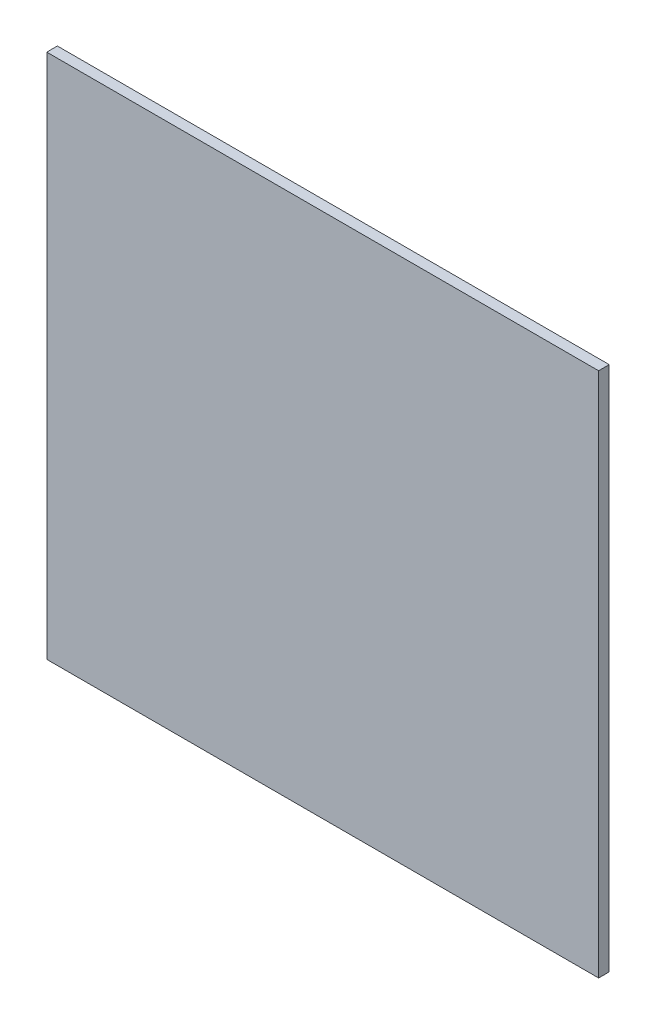
ISO-10303-21;
HEADER;
FILE_DESCRIPTION(('STEP AP214'),'2;1');
FILE_NAME('part.step','',(''),(''),'','','');
FILE_SCHEMA(('AUTOMOTIVE_DESIGN { 1 0 10303 214 1 1 1 1 }'));
ENDSEC;
DATA;
#1=APPLICATION_CONTEXT('core data for automotive mechanical design processes');
#2=APPLICATION_PROTOCOL_DEFINITION('international standard','automotive_design',2000,#1);
#3=PRODUCT_CONTEXT('',#1,'mechanical');
#4=PRODUCT('Part','Part','',(#3));
#5=PRODUCT_RELATED_PRODUCT_CATEGORY('part','',(#4));
#6=PRODUCT_DEFINITION_FORMATION('','',#4);
#7=PRODUCT_DEFINITION_CONTEXT('part definition',#1,'design');
#8=PRODUCT_DEFINITION('design','',#6,#7);
#9=PRODUCT_DEFINITION_SHAPE('','',#8);
#10=(LENGTH_UNIT() NAMED_UNIT(*) SI_UNIT(.MILLI.,.METRE.));
#11=(NAMED_UNIT(*) PLANE_ANGLE_UNIT() SI_UNIT($,.RADIAN.));
#12=(NAMED_UNIT(*) SI_UNIT($,.STERADIAN.) SOLID_ANGLE_UNIT());
#13=UNCERTAINTY_MEASURE_WITH_UNIT(LENGTH_MEASURE(1.E-05),#10,'distance_accuracy_value','');
#14=(GEOMETRIC_REPRESENTATION_CONTEXT(3) GLOBAL_UNCERTAINTY_ASSIGNED_CONTEXT((#13)) GLOBAL_UNIT_ASSIGNED_CONTEXT((#10,
#11,#12)) REPRESENTATION_CONTEXT('',''));
#15=CARTESIAN_POINT('',(0.,0.,0.));
#16=DIRECTION('',(0.,0.,1.));
#17=DIRECTION('',(1.,0.,0.));
#18=AXIS2_PLACEMENT_3D('',#15,#16,#17);
#19=CARTESIAN_POINT('',(78.,-79.6217987433848,3.));
#20=DIRECTION('',(-1.,0.,0.));
#21=DIRECTION('',(0.,0.,1.));
#22=AXIS2_PLACEMENT_3D('',#19,#20,#21);
#23=PLANE('',#22);
#24=DIRECTION('',(0.,1.,0.));
#25=VECTOR('',#24,1.);
#26=CARTESIAN_POINT('',(78.,-79.6217987433848,0.));
#27=LINE('',#26,#25);
#28=CARTESIAN_POINT('',(78.,-79.6217987433848,0.));
#29=VERTEX_POINT('',#28);
#30=CARTESIAN_POINT('',(78.,69.0382012566152,0.));
#31=VERTEX_POINT('',#30);
#32=EDGE_CURVE('E96',#29,#31,#27,.T.);
#33=ORIENTED_EDGE('',*,*,#32,.T.);
#34=DIRECTION('',(0.,0.,-1.));
#35=VECTOR('',#34,1.);
#36=CARTESIAN_POINT('',(78.,69.0382012566152,3.));
#37=LINE('',#36,#35);
#38=CARTESIAN_POINT('',(78.,69.0382012566152,3.));
#39=VERTEX_POINT('',#38);
#40=EDGE_CURVE('E11',#39,#31,#37,.T.);
#41=ORIENTED_EDGE('',*,*,#40,.F.);
#42=DIRECTION('',(0.,1.,0.));
#43=VECTOR('',#42,1.);
#44=CARTESIAN_POINT('',(78.,-79.6217987433848,3.));
#45=LINE('',#44,#43);
#46=CARTESIAN_POINT('',(78.,-79.6217987433848,3.));
#47=VERTEX_POINT('',#46);
#48=EDGE_CURVE('E84',#47,#39,#45,.T.);
#49=ORIENTED_EDGE('',*,*,#48,.F.);
#50=DIRECTION('',(0.,0.,-1.));
#51=VECTOR('',#50,1.);
#52=CARTESIAN_POINT('',(78.,-79.6217987433848,3.));
#53=LINE('',#52,#51);
#54=EDGE_CURVE('E92',#47,#29,#53,.T.);
#55=ORIENTED_EDGE('',*,*,#54,.T.);
#56=EDGE_LOOP('',(#33,#41,#49,#55));
#57=FACE_BOUND('',#56,.T.);
#58=ADVANCED_FACE('F33',(#57),#23,.F.);
#59=CARTESIAN_POINT('',(-78.,69.0382012566152,3.));
#60=DIRECTION('',(0.,-1.,0.));
#61=DIRECTION('',(0.,0.,-1.));
#62=AXIS2_PLACEMENT_3D('',#59,#60,#61);
#63=PLANE('',#62);
#64=DIRECTION('',(-1.,0.,0.));
#65=VECTOR('',#64,1.);
#66=CARTESIAN_POINT('',(-78.,69.0382012566152,0.));
#67=LINE('',#66,#65);
#68=CARTESIAN_POINT('',(-78.,69.0382012566152,0.));
#69=VERTEX_POINT('',#68);
#70=EDGE_CURVE('E88',#31,#69,#67,.T.);
#71=ORIENTED_EDGE('',*,*,#70,.T.);
#72=DIRECTION('',(0.,0.,-1.));
#73=VECTOR('',#72,1.);
#74=CARTESIAN_POINT('',(-78.,69.0382012566152,3.));
#75=LINE('',#74,#73);
#76=CARTESIAN_POINT('',(-78.,69.0382012566152,3.));
#77=VERTEX_POINT('',#76);
#78=EDGE_CURVE('E41',#77,#69,#75,.T.);
#79=ORIENTED_EDGE('',*,*,#78,.F.);
#80=DIRECTION('',(-1.,0.,0.));
#81=VECTOR('',#80,1.);
#82=CARTESIAN_POINT('',(-78.,69.0382012566152,3.));
#83=LINE('',#82,#81);
#84=EDGE_CURVE('E79',#39,#77,#83,.T.);
#85=ORIENTED_EDGE('',*,*,#84,.F.);
#86=ORIENTED_EDGE('',*,*,#40,.T.);
#87=EDGE_LOOP('',(#71,#79,#85,#86));
#88=FACE_BOUND('',#87,.T.);
#89=ADVANCED_FACE('F87',(#88),#63,.F.);
#90=CARTESIAN_POINT('',(-78.,-79.6217987433848,3.));
#91=DIRECTION('',(1.,0.,0.));
#92=DIRECTION('',(0.,0.,-1.));
#93=AXIS2_PLACEMENT_3D('',#90,#91,#92);
#94=PLANE('',#93);
#95=DIRECTION('',(0.,-1.,0.));
#96=VECTOR('',#95,1.);
#97=CARTESIAN_POINT('',(-78.,-79.6217987433848,0.));
#98=LINE('',#97,#96);
#99=CARTESIAN_POINT('',(-78.,-79.6217987433848,0.));
#100=VERTEX_POINT('',#99);
#101=EDGE_CURVE('E66',#69,#100,#98,.T.);
#102=ORIENTED_EDGE('',*,*,#101,.T.);
#103=DIRECTION('',(0.,0.,-1.));
#104=VECTOR('',#103,1.);
#105=CARTESIAN_POINT('',(-78.,-79.6217987433848,3.));
#106=LINE('',#105,#104);
#107=CARTESIAN_POINT('',(-78.,-79.6217987433848,3.));
#108=VERTEX_POINT('',#107);
#109=EDGE_CURVE('E89',#108,#100,#106,.T.);
#110=ORIENTED_EDGE('',*,*,#109,.F.);
#111=DIRECTION('',(0.,-1.,0.));
#112=VECTOR('',#111,1.);
#113=CARTESIAN_POINT('',(-78.,-79.6217987433848,3.));
#114=LINE('',#113,#112);
#115=EDGE_CURVE('E82',#77,#108,#114,.T.);
#116=ORIENTED_EDGE('',*,*,#115,.F.);
#117=ORIENTED_EDGE('',*,*,#78,.T.);
#118=EDGE_LOOP('',(#102,#110,#116,#117));
#119=FACE_BOUND('',#118,.T.);
#120=ADVANCED_FACE('F90',(#119),#94,.F.);
#121=CARTESIAN_POINT('',(-78.,-79.6217987433848,3.));
#122=DIRECTION('',(0.,1.,0.));
#123=DIRECTION('',(0.,0.,1.));
#124=AXIS2_PLACEMENT_3D('',#121,#122,#123);
#125=PLANE('',#124);
#126=DIRECTION('',(1.,0.,0.));
#127=VECTOR('',#126,1.);
#128=CARTESIAN_POINT('',(-78.,-79.6217987433848,0.));
#129=LINE('',#128,#127);
#130=EDGE_CURVE('E72',#100,#29,#129,.T.);
#131=ORIENTED_EDGE('',*,*,#130,.T.);
#132=ORIENTED_EDGE('',*,*,#54,.F.);
#133=DIRECTION('',(1.,0.,0.));
#134=VECTOR('',#133,1.);
#135=CARTESIAN_POINT('',(-78.,-79.6217987433848,3.));
#136=LINE('',#135,#134);
#137=EDGE_CURVE('E49',#108,#47,#136,.T.);
#138=ORIENTED_EDGE('',*,*,#137,.F.);
#139=ORIENTED_EDGE('',*,*,#109,.T.);
#140=EDGE_LOOP('',(#131,#132,#138,#139));
#141=FACE_BOUND('',#140,.T.);
#142=ADVANCED_FACE('F103',(#141),#125,.F.);
#143=CARTESIAN_POINT('',(0.,0.,3.));
#144=DIRECTION('',(0.,0.,-1.));
#145=DIRECTION('',(-1.,0.,0.));
#146=AXIS2_PLACEMENT_3D('',#143,#144,#145);
#147=PLANE('',#146);
#148=ORIENTED_EDGE('',*,*,#48,.T.);
#149=ORIENTED_EDGE('',*,*,#84,.T.);
#150=ORIENTED_EDGE('',*,*,#115,.T.);
#151=ORIENTED_EDGE('',*,*,#137,.T.);
#152=EDGE_LOOP('',(#148,#149,#150,#151));
#153=FACE_BOUND('',#152,.T.);
#154=ADVANCED_FACE('F80',(#153),#147,.F.);
#155=CARTESIAN_POINT('',(0.,0.,0.));
#156=DIRECTION('',(0.,0.,-1.));
#157=DIRECTION('',(-1.,0.,0.));
#158=AXIS2_PLACEMENT_3D('',#155,#156,#157);
#159=PLANE('',#158);
#160=ORIENTED_EDGE('',*,*,#32,.F.);
#161=ORIENTED_EDGE('',*,*,#130,.F.);
#162=ORIENTED_EDGE('',*,*,#101,.F.);
#163=ORIENTED_EDGE('',*,*,#70,.F.);
#164=EDGE_LOOP('',(#160,#161,#162,#163));
#165=FACE_BOUND('',#164,.T.);
#166=ADVANCED_FACE('F106',(#165),#159,.T.);
#167=CLOSED_SHELL('',(#58,#89,#120,#142,#154,#166));
#168=MANIFOLD_SOLID_BREP('B2',#167);
#169=ADVANCED_BREP_SHAPE_REPRESENTATION('',(#18,#168),#14);
#170=SHAPE_DEFINITION_REPRESENTATION(#9,#169);
ENDSEC;
END-ISO-10303-21;
